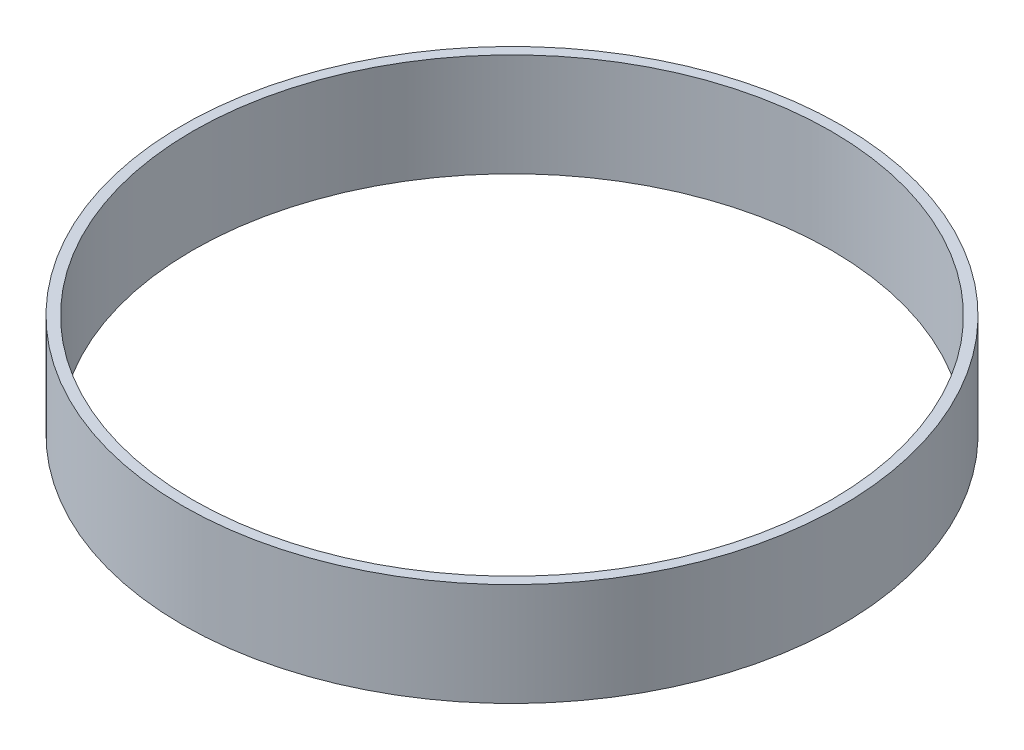
ISO-10303-21;
HEADER;
FILE_DESCRIPTION(('STEP AP214'),'2;1');
FILE_NAME('part.step','',(''),(''),'','','');
FILE_SCHEMA(('AUTOMOTIVE_DESIGN { 1 0 10303 214 1 1 1 1 }'));
ENDSEC;
DATA;
#1=APPLICATION_CONTEXT('core data for automotive mechanical design processes');
#2=APPLICATION_PROTOCOL_DEFINITION('international standard','automotive_design',2000,#1);
#3=PRODUCT_CONTEXT('',#1,'mechanical');
#4=PRODUCT('Part','Part','',(#3));
#5=PRODUCT_RELATED_PRODUCT_CATEGORY('part','',(#4));
#6=PRODUCT_DEFINITION_FORMATION('','',#4);
#7=PRODUCT_DEFINITION_CONTEXT('part definition',#1,'design');
#8=PRODUCT_DEFINITION('design','',#6,#7);
#9=PRODUCT_DEFINITION_SHAPE('','',#8);
#10=(LENGTH_UNIT() NAMED_UNIT(*) SI_UNIT(.MILLI.,.METRE.));
#11=(NAMED_UNIT(*) PLANE_ANGLE_UNIT() SI_UNIT($,.RADIAN.));
#12=(NAMED_UNIT(*) SI_UNIT($,.STERADIAN.) SOLID_ANGLE_UNIT());
#13=UNCERTAINTY_MEASURE_WITH_UNIT(LENGTH_MEASURE(1.E-05),#10,'distance_accuracy_value','');
#14=(GEOMETRIC_REPRESENTATION_CONTEXT(3) GLOBAL_UNCERTAINTY_ASSIGNED_CONTEXT((#13)) GLOBAL_UNIT_ASSIGNED_CONTEXT((#10,
#11,#12)) REPRESENTATION_CONTEXT('',''));
#15=CARTESIAN_POINT('',(0.,0.,0.));
#16=DIRECTION('',(0.,0.,1.));
#17=DIRECTION('',(1.,0.,0.));
#18=AXIS2_PLACEMENT_3D('',#15,#16,#17);
#19=CARTESIAN_POINT('',(0.,50000.,0.));
#20=DIRECTION('',(0.,1.,0.));
#21=DIRECTION('',(0.,0.,1.));
#22=AXIS2_PLACEMENT_3D('',#19,#20,#21);
#23=PLANE('',#22);
#24=CARTESIAN_POINT('',(0.,50000.,0.));
#25=DIRECTION('',(0.,1.,0.));
#26=DIRECTION('',(0.,0.,1.));
#27=AXIS2_PLACEMENT_3D('',#24,#25,#26);
#28=CIRCLE('',#27,160000.);
#29=CARTESIAN_POINT('',(0.,50000.,160000.));
#30=VERTEX_POINT('',#29);
#31=EDGE_CURVE('E10',#30,#30,#28,.T.);
#32=ORIENTED_EDGE('',*,*,#31,.T.);
#33=EDGE_LOOP('',(#32));
#34=FACE_BOUND('',#33,.T.);
#35=CARTESIAN_POINT('',(0.,50000.,0.));
#36=DIRECTION('',(0.,1.,0.));
#37=DIRECTION('',(0.,0.,1.));
#38=AXIS2_PLACEMENT_3D('',#35,#36,#37);
#39=CIRCLE('',#38,155000.);
#40=CARTESIAN_POINT('',(0.,50000.,155000.));
#41=VERTEX_POINT('',#40);
#42=EDGE_CURVE('E41',#41,#41,#39,.T.);
#43=ORIENTED_EDGE('',*,*,#42,.F.);
#44=EDGE_LOOP('',(#43));
#45=FACE_BOUND('',#44,.T.);
#46=ADVANCED_FACE('F30',(#34,#45),#23,.T.);
#47=CARTESIAN_POINT('',(0.,0.,0.));
#48=DIRECTION('',(0.,1.,0.));
#49=DIRECTION('',(0.,0.,1.));
#50=AXIS2_PLACEMENT_3D('',#47,#48,#49);
#51=PLANE('',#50);
#52=CARTESIAN_POINT('',(0.,0.,0.));
#53=DIRECTION('',(0.,1.,0.));
#54=DIRECTION('',(0.,0.,1.));
#55=AXIS2_PLACEMENT_3D('',#52,#53,#54);
#56=CIRCLE('',#55,160000.);
#57=CARTESIAN_POINT('',(0.,0.,160000.));
#58=VERTEX_POINT('',#57);
#59=EDGE_CURVE('E34',#58,#58,#56,.T.);
#60=ORIENTED_EDGE('',*,*,#59,.F.);
#61=EDGE_LOOP('',(#60));
#62=FACE_BOUND('',#61,.T.);
#63=CARTESIAN_POINT('',(0.,0.,0.));
#64=DIRECTION('',(0.,1.,0.));
#65=DIRECTION('',(0.,0.,1.));
#66=AXIS2_PLACEMENT_3D('',#63,#64,#65);
#67=CIRCLE('',#66,155000.);
#68=CARTESIAN_POINT('',(0.,0.,155000.));
#69=VERTEX_POINT('',#68);
#70=EDGE_CURVE('E43',#69,#69,#67,.T.);
#71=ORIENTED_EDGE('',*,*,#70,.T.);
#72=EDGE_LOOP('',(#71));
#73=FACE_BOUND('',#72,.T.);
#74=ADVANCED_FACE('F53',(#62,#73),#51,.F.);
#75=CARTESIAN_POINT('',(0.,50000.,0.));
#76=DIRECTION('',(0.,-1.,0.));
#77=DIRECTION('',(0.,0.,-1.));
#78=AXIS2_PLACEMENT_3D('',#75,#76,#77);
#79=CYLINDRICAL_SURFACE('',#78,160000.);
#80=ORIENTED_EDGE('',*,*,#31,.F.);
#81=EDGE_LOOP('',(#80));
#82=FACE_BOUND('',#81,.T.);
#83=ORIENTED_EDGE('',*,*,#59,.T.);
#84=EDGE_LOOP('',(#83));
#85=FACE_BOUND('',#84,.T.);
#86=ADVANCED_FACE('F32',(#82,#85),#79,.T.);
#87=CARTESIAN_POINT('',(0.,50000.,0.));
#88=DIRECTION('',(0.,-1.,0.));
#89=DIRECTION('',(0.,0.,-1.));
#90=AXIS2_PLACEMENT_3D('',#87,#88,#89);
#91=CYLINDRICAL_SURFACE('',#90,155000.);
#92=ORIENTED_EDGE('',*,*,#42,.T.);
#93=EDGE_LOOP('',(#92));
#94=FACE_BOUND('',#93,.T.);
#95=ORIENTED_EDGE('',*,*,#70,.F.);
#96=EDGE_LOOP('',(#95));
#97=FACE_BOUND('',#96,.T.);
#98=ADVANCED_FACE('F49',(#94,#97),#91,.F.);
#99=CLOSED_SHELL('',(#46,#74,#86,#98));
#100=MANIFOLD_SOLID_BREP('B2',#99);
#101=ADVANCED_BREP_SHAPE_REPRESENTATION('',(#18,#100),#14);
#102=SHAPE_DEFINITION_REPRESENTATION(#9,#101);
ENDSEC;
END-ISO-10303-21;
